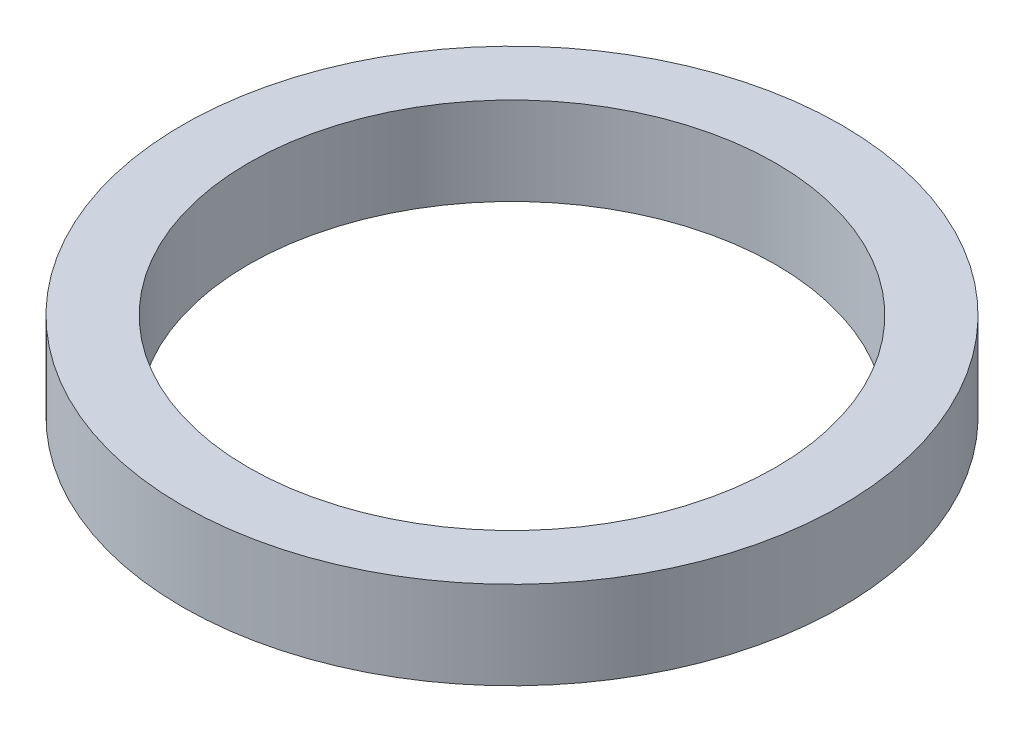
ISO-10303-21;
HEADER;
FILE_DESCRIPTION(('STEP AP214'),'2;1');
FILE_NAME('part.step','',(''),(''),'','','');
FILE_SCHEMA(('AUTOMOTIVE_DESIGN { 1 0 10303 214 1 1 1 1 }'));
ENDSEC;
DATA;
#1=APPLICATION_CONTEXT('core data for automotive mechanical design processes');
#2=APPLICATION_PROTOCOL_DEFINITION('international standard','automotive_design',2000,#1);
#3=PRODUCT_CONTEXT('',#1,'mechanical');
#4=PRODUCT('Part','Part','',(#3));
#5=PRODUCT_RELATED_PRODUCT_CATEGORY('part','',(#4));
#6=PRODUCT_DEFINITION_FORMATION('','',#4);
#7=PRODUCT_DEFINITION_CONTEXT('part definition',#1,'design');
#8=PRODUCT_DEFINITION('design','',#6,#7);
#9=PRODUCT_DEFINITION_SHAPE('','',#8);
#10=(LENGTH_UNIT() NAMED_UNIT(*) SI_UNIT(.MILLI.,.METRE.));
#11=(NAMED_UNIT(*) PLANE_ANGLE_UNIT() SI_UNIT($,.RADIAN.));
#12=(NAMED_UNIT(*) SI_UNIT($,.STERADIAN.) SOLID_ANGLE_UNIT());
#13=UNCERTAINTY_MEASURE_WITH_UNIT(LENGTH_MEASURE(1.E-05),#10,'distance_accuracy_value','');
#14=(GEOMETRIC_REPRESENTATION_CONTEXT(3) GLOBAL_UNCERTAINTY_ASSIGNED_CONTEXT((#13)) GLOBAL_UNIT_ASSIGNED_CONTEXT((#10,
#11,#12)) REPRESENTATION_CONTEXT('',''));
#15=CARTESIAN_POINT('',(0.,0.,0.));
#16=DIRECTION('',(0.,0.,1.));
#17=DIRECTION('',(1.,0.,0.));
#18=AXIS2_PLACEMENT_3D('',#15,#16,#17);
#19=CARTESIAN_POINT('',(0.,2.,0.));
#20=DIRECTION('',(0.,1.,0.));
#21=DIRECTION('',(0.,0.,1.));
#22=AXIS2_PLACEMENT_3D('',#19,#20,#21);
#23=PLANE('',#22);
#24=CARTESIAN_POINT('',(0.,2.,0.));
#25=DIRECTION('',(0.,1.,0.));
#26=DIRECTION('',(0.,0.,1.));
#27=AXIS2_PLACEMENT_3D('',#24,#25,#26);
#28=CIRCLE('',#27,7.5);
#29=CARTESIAN_POINT('',(0.,2.,7.5));
#30=VERTEX_POINT('',#29);
#31=EDGE_CURVE('E10',#30,#30,#28,.T.);
#32=ORIENTED_EDGE('',*,*,#31,.T.);
#33=EDGE_LOOP('',(#32));
#34=FACE_BOUND('',#33,.T.);
#35=CARTESIAN_POINT('',(0.,2.,0.));
#36=DIRECTION('',(0.,1.,0.));
#37=DIRECTION('',(0.,0.,1.));
#38=AXIS2_PLACEMENT_3D('',#35,#36,#37);
#39=CIRCLE('',#38,6.);
#40=CARTESIAN_POINT('',(0.,2.,6.));
#41=VERTEX_POINT('',#40);
#42=EDGE_CURVE('E50',#41,#41,#39,.T.);
#43=ORIENTED_EDGE('',*,*,#42,.F.);
#44=EDGE_LOOP('',(#43));
#45=FACE_BOUND('',#44,.T.);
#46=ADVANCED_FACE('F39',(#34,#45),#23,.T.);
#47=CARTESIAN_POINT('',(0.,0.,0.));
#48=DIRECTION('',(0.,1.,0.));
#49=DIRECTION('',(0.,0.,1.));
#50=AXIS2_PLACEMENT_3D('',#47,#48,#49);
#51=PLANE('',#50);
#52=CARTESIAN_POINT('',(0.,0.,0.));
#53=DIRECTION('',(0.,1.,0.));
#54=DIRECTION('',(0.,0.,1.));
#55=AXIS2_PLACEMENT_3D('',#52,#53,#54);
#56=CIRCLE('',#55,7.5);
#57=CARTESIAN_POINT('',(0.,0.,7.5));
#58=VERTEX_POINT('',#57);
#59=EDGE_CURVE('E43',#58,#58,#56,.T.);
#60=ORIENTED_EDGE('',*,*,#59,.F.);
#61=EDGE_LOOP('',(#60));
#62=FACE_BOUND('',#61,.T.);
#63=CARTESIAN_POINT('',(0.,0.,0.));
#64=DIRECTION('',(0.,1.,0.));
#65=DIRECTION('',(0.,0.,1.));
#66=AXIS2_PLACEMENT_3D('',#63,#64,#65);
#67=CIRCLE('',#66,6.);
#68=CARTESIAN_POINT('',(0.,0.,6.));
#69=VERTEX_POINT('',#68);
#70=EDGE_CURVE('E52',#69,#69,#67,.T.);
#71=ORIENTED_EDGE('',*,*,#70,.T.);
#72=EDGE_LOOP('',(#71));
#73=FACE_BOUND('',#72,.T.);
#74=ADVANCED_FACE('F62',(#62,#73),#51,.F.);
#75=CARTESIAN_POINT('',(0.,2.,0.));
#76=DIRECTION('',(0.,-1.,0.));
#77=DIRECTION('',(0.,0.,-1.));
#78=AXIS2_PLACEMENT_3D('',#75,#76,#77);
#79=CYLINDRICAL_SURFACE('',#78,7.5);
#80=ORIENTED_EDGE('',*,*,#31,.F.);
#81=EDGE_LOOP('',(#80));
#82=FACE_BOUND('',#81,.T.);
#83=ORIENTED_EDGE('',*,*,#59,.T.);
#84=EDGE_LOOP('',(#83));
#85=FACE_BOUND('',#84,.T.);
#86=ADVANCED_FACE('F41',(#82,#85),#79,.T.);
#87=CARTESIAN_POINT('',(0.,2.,0.));
#88=DIRECTION('',(0.,-1.,0.));
#89=DIRECTION('',(0.,0.,-1.));
#90=AXIS2_PLACEMENT_3D('',#87,#88,#89);
#91=CYLINDRICAL_SURFACE('',#90,6.);
#92=ORIENTED_EDGE('',*,*,#42,.T.);
#93=EDGE_LOOP('',(#92));
#94=FACE_BOUND('',#93,.T.);
#95=ORIENTED_EDGE('',*,*,#70,.F.);
#96=EDGE_LOOP('',(#95));
#97=FACE_BOUND('',#96,.T.);
#98=ADVANCED_FACE('F58',(#94,#97),#91,.F.);
#99=CLOSED_SHELL('',(#46,#74,#86,#98));
#100=MANIFOLD_SOLID_BREP('B2',#99);
#101=ADVANCED_BREP_SHAPE_REPRESENTATION('',(#18,#100),#14);
#102=SHAPE_DEFINITION_REPRESENTATION(#9,#101);
ENDSEC;
END-ISO-10303-21;
